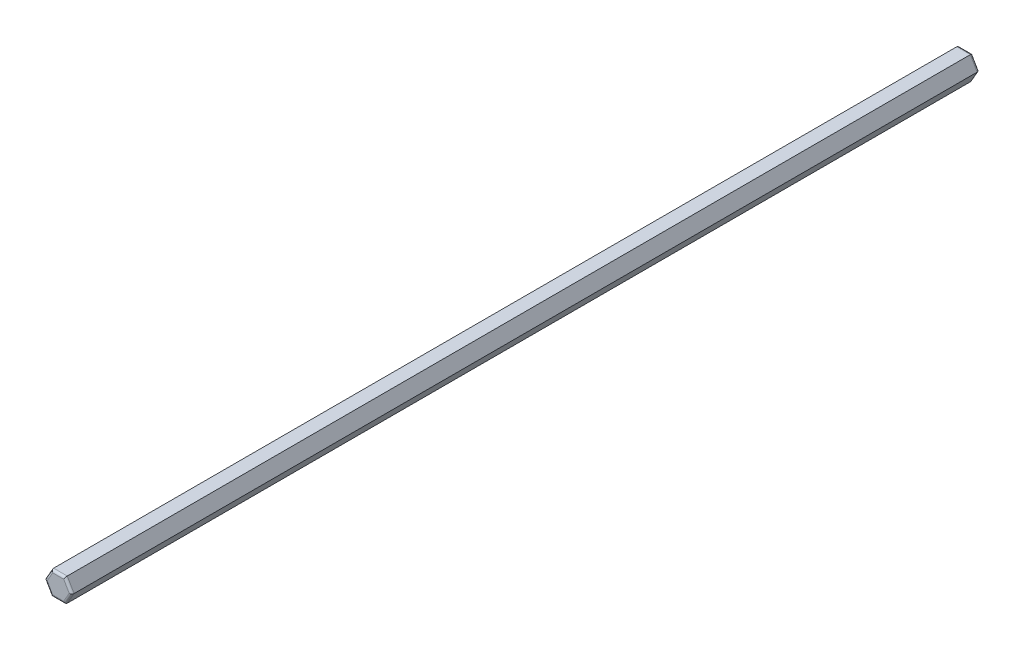
ISO-10303-21;
HEADER;
FILE_DESCRIPTION(('STEP AP214'),'2;1');
FILE_NAME('part.step','',(''),(''),'','','');
FILE_SCHEMA(('AUTOMOTIVE_DESIGN { 1 0 10303 214 1 1 1 1 }'));
ENDSEC;
DATA;
#1=APPLICATION_CONTEXT('core data for automotive mechanical design processes');
#2=APPLICATION_PROTOCOL_DEFINITION('international standard','automotive_design',2000,#1);
#3=PRODUCT_CONTEXT('',#1,'mechanical');
#4=PRODUCT('Part','Part','',(#3));
#5=PRODUCT_RELATED_PRODUCT_CATEGORY('part','',(#4));
#6=PRODUCT_DEFINITION_FORMATION('','',#4);
#7=PRODUCT_DEFINITION_CONTEXT('part definition',#1,'design');
#8=PRODUCT_DEFINITION('design','',#6,#7);
#9=PRODUCT_DEFINITION_SHAPE('','',#8);
#10=(LENGTH_UNIT() NAMED_UNIT(*) SI_UNIT(.MILLI.,.METRE.));
#11=(NAMED_UNIT(*) PLANE_ANGLE_UNIT() SI_UNIT($,.RADIAN.));
#12=(NAMED_UNIT(*) SI_UNIT($,.STERADIAN.) SOLID_ANGLE_UNIT());
#13=UNCERTAINTY_MEASURE_WITH_UNIT(LENGTH_MEASURE(1.E-05),#10,'distance_accuracy_value','');
#14=(GEOMETRIC_REPRESENTATION_CONTEXT(3) GLOBAL_UNCERTAINTY_ASSIGNED_CONTEXT((#13)) GLOBAL_UNIT_ASSIGNED_CONTEXT((#10,
#11,#12)) REPRESENTATION_CONTEXT('',''));
#15=CARTESIAN_POINT('',(0.,0.,0.));
#16=DIRECTION('',(0.,0.,1.));
#17=DIRECTION('',(1.,0.,0.));
#18=AXIS2_PLACEMENT_3D('',#15,#16,#17);
#19=CARTESIAN_POINT('',(0.749999999999999,1.29903810567666,-50.));
#20=DIRECTION('',(0.,1.,0.));
#21=DIRECTION('',(0.,0.,1.));
#22=AXIS2_PLACEMENT_3D('',#19,#20,#21);
#23=PLANE('',#22);
#24=DIRECTION('',(0.,0.,1.));
#25=VECTOR('',#24,1.);
#26=CARTESIAN_POINT('',(0.749999999999999,1.29903810567666,-50.));
#27=LINE('',#26,#25);
#28=CARTESIAN_POINT('',(0.749999999999999,1.29903810567666,-49.75));
#29=VERTEX_POINT('',#28);
#30=CARTESIAN_POINT('',(0.749999999999999,1.29903810567666,49.75));
#31=VERTEX_POINT('',#30);
#32=EDGE_CURVE('E161',#29,#31,#27,.T.);
#33=ORIENTED_EDGE('',*,*,#32,.F.);
#34=DIRECTION('',(-1.,0.,0.));
#35=VECTOR('',#34,1.);
#36=CARTESIAN_POINT('',(-0.75,1.29903810567666,-49.75));
#37=LINE('',#36,#35);
#38=CARTESIAN_POINT('',(-0.75,1.29903810567666,-49.75));
#39=VERTEX_POINT('',#38);
#40=EDGE_CURVE('E202',#29,#39,#37,.T.);
#41=ORIENTED_EDGE('',*,*,#40,.T.);
#42=DIRECTION('',(0.,0.,1.));
#43=VECTOR('',#42,1.);
#44=CARTESIAN_POINT('',(-0.75,1.29903810567666,-50.));
#45=LINE('',#44,#43);
#46=CARTESIAN_POINT('',(-0.75,1.29903810567666,49.75));
#47=VERTEX_POINT('',#46);
#48=EDGE_CURVE('E172',#39,#47,#45,.T.);
#49=ORIENTED_EDGE('',*,*,#48,.T.);
#50=DIRECTION('',(-1.,0.,0.));
#51=VECTOR('',#50,1.);
#52=CARTESIAN_POINT('',(0.749999999999999,1.29903810567666,49.75));
#53=LINE('',#52,#51);
#54=EDGE_CURVE('E200',#47,#31,#53,.F.);
#55=ORIENTED_EDGE('',*,*,#54,.T.);
#56=EDGE_LOOP('',(#33,#41,#49,#55));
#57=FACE_BOUND('',#56,.T.);
#58=ADVANCED_FACE('F32',(#57),#23,.T.);
#59=CARTESIAN_POINT('',(1.5,0.,-50.));
#60=DIRECTION('',(0.866025403784439,0.5,0.));
#61=DIRECTION('',(-0.5,0.866025403784439,0.));
#62=AXIS2_PLACEMENT_3D('',#59,#60,#61);
#63=PLANE('',#62);
#64=DIRECTION('',(0.,0.,1.));
#65=VECTOR('',#64,1.);
#66=CARTESIAN_POINT('',(1.5,0.,-50.));
#67=LINE('',#66,#65);
#68=CARTESIAN_POINT('',(1.5,0.,-49.75));
#69=VERTEX_POINT('',#68);
#70=CARTESIAN_POINT('',(1.5,0.,49.75));
#71=VERTEX_POINT('',#70);
#72=EDGE_CURVE('E151',#69,#71,#67,.T.);
#73=ORIENTED_EDGE('',*,*,#72,.F.);
#74=DIRECTION('',(-0.5,0.866025403784439,0.));
#75=VECTOR('',#74,1.);
#76=CARTESIAN_POINT('',(0.749999999999999,1.29903810567666,-49.75));
#77=LINE('',#76,#75);
#78=EDGE_CURVE('E136',#69,#29,#77,.T.);
#79=ORIENTED_EDGE('',*,*,#78,.T.);
#80=ORIENTED_EDGE('',*,*,#32,.T.);
#81=DIRECTION('',(-0.5,0.866025403784439,0.));
#82=VECTOR('',#81,1.);
#83=CARTESIAN_POINT('',(1.5,0.,49.75));
#84=LINE('',#83,#82);
#85=EDGE_CURVE('E145',#31,#71,#84,.F.);
#86=ORIENTED_EDGE('',*,*,#85,.T.);
#87=EDGE_LOOP('',(#73,#79,#80,#86));
#88=FACE_BOUND('',#87,.T.);
#89=ADVANCED_FACE('F159',(#88),#63,.T.);
#90=CARTESIAN_POINT('',(0.750000000000001,-1.29903810567666,-50.));
#91=DIRECTION('',(0.866025403784439,-0.499999999999999,0.));
#92=DIRECTION('',(0.499999999999999,0.866025403784439,0.));
#93=AXIS2_PLACEMENT_3D('',#90,#91,#92);
#94=PLANE('',#93);
#95=DIRECTION('',(0.,0.,1.));
#96=VECTOR('',#95,1.);
#97=CARTESIAN_POINT('',(0.750000000000001,-1.29903810567666,-50.));
#98=LINE('',#97,#96);
#99=CARTESIAN_POINT('',(0.750000000000001,-1.29903810567666,-49.75));
#100=VERTEX_POINT('',#99);
#101=CARTESIAN_POINT('',(0.750000000000001,-1.29903810567666,49.75));
#102=VERTEX_POINT('',#101);
#103=EDGE_CURVE('E154',#100,#102,#98,.T.);
#104=ORIENTED_EDGE('',*,*,#103,.F.);
#105=DIRECTION('',(0.499999999999999,0.866025403784439,0.));
#106=VECTOR('',#105,1.);
#107=CARTESIAN_POINT('',(1.5,0.,-49.75));
#108=LINE('',#107,#106);
#109=EDGE_CURVE('E128',#100,#69,#108,.T.);
#110=ORIENTED_EDGE('',*,*,#109,.T.);
#111=ORIENTED_EDGE('',*,*,#72,.T.);
#112=DIRECTION('',(0.499999999999999,0.866025403784439,0.));
#113=VECTOR('',#112,1.);
#114=CARTESIAN_POINT('',(0.750000000000001,-1.29903810567666,49.75));
#115=LINE('',#114,#113);
#116=EDGE_CURVE('E157',#71,#102,#115,.F.);
#117=ORIENTED_EDGE('',*,*,#116,.T.);
#118=EDGE_LOOP('',(#104,#110,#111,#117));
#119=FACE_BOUND('',#118,.T.);
#120=ADVANCED_FACE('F150',(#119),#94,.T.);
#121=CARTESIAN_POINT('',(-0.749999999999999,-1.29903810567666,-50.));
#122=DIRECTION('',(0.,-1.,0.));
#123=DIRECTION('',(0.,0.,-1.));
#124=AXIS2_PLACEMENT_3D('',#121,#122,#123);
#125=PLANE('',#124);
#126=DIRECTION('',(0.,0.,1.));
#127=VECTOR('',#126,1.);
#128=CARTESIAN_POINT('',(-0.749999999999999,-1.29903810567666,-50.));
#129=LINE('',#128,#127);
#130=CARTESIAN_POINT('',(-0.749999999999999,-1.29903810567666,-49.75));
#131=VERTEX_POINT('',#130);
#132=CARTESIAN_POINT('',(-0.749999999999999,-1.29903810567666,49.75));
#133=VERTEX_POINT('',#132);
#134=EDGE_CURVE('E164',#131,#133,#129,.T.);
#135=ORIENTED_EDGE('',*,*,#134,.F.);
#136=DIRECTION('',(1.,0.,0.));
#137=VECTOR('',#136,1.);
#138=CARTESIAN_POINT('',(0.750000000000001,-1.29903810567666,-49.75));
#139=LINE('',#138,#137);
#140=EDGE_CURVE('E189',#131,#100,#139,.T.);
#141=ORIENTED_EDGE('',*,*,#140,.T.);
#142=ORIENTED_EDGE('',*,*,#103,.T.);
#143=DIRECTION('',(1.,0.,0.));
#144=VECTOR('',#143,1.);
#145=CARTESIAN_POINT('',(-0.749999999999999,-1.29903810567666,49.75));
#146=LINE('',#145,#144);
#147=EDGE_CURVE('E187',#102,#133,#146,.F.);
#148=ORIENTED_EDGE('',*,*,#147,.T.);
#149=EDGE_LOOP('',(#135,#141,#142,#148));
#150=FACE_BOUND('',#149,.T.);
#151=ADVANCED_FACE('F246',(#150),#125,.T.);
#152=CARTESIAN_POINT('',(-1.5,0.,-50.));
#153=DIRECTION('',(-0.866025403784438,-0.500000000000001,0.));
#154=DIRECTION('',(0.500000000000001,-0.866025403784438,0.));
#155=AXIS2_PLACEMENT_3D('',#152,#153,#154);
#156=PLANE('',#155);
#157=DIRECTION('',(0.,0.,1.));
#158=VECTOR('',#157,1.);
#159=CARTESIAN_POINT('',(-1.5,0.,-50.));
#160=LINE('',#159,#158);
#161=CARTESIAN_POINT('',(-1.5,0.,-49.75));
#162=VERTEX_POINT('',#161);
#163=CARTESIAN_POINT('',(-1.5,0.,49.75));
#164=VERTEX_POINT('',#163);
#165=EDGE_CURVE('E169',#162,#164,#160,.T.);
#166=ORIENTED_EDGE('',*,*,#165,.F.);
#167=DIRECTION('',(0.500000000000001,-0.866025403784438,0.));
#168=VECTOR('',#167,1.);
#169=CARTESIAN_POINT('',(-0.749999999999999,-1.29903810567666,-49.75));
#170=LINE('',#169,#168);
#171=EDGE_CURVE('E193',#162,#131,#170,.T.);
#172=ORIENTED_EDGE('',*,*,#171,.T.);
#173=ORIENTED_EDGE('',*,*,#134,.T.);
#174=DIRECTION('',(0.500000000000001,-0.866025403784438,0.));
#175=VECTOR('',#174,1.);
#176=CARTESIAN_POINT('',(-1.5,0.,49.75));
#177=LINE('',#176,#175);
#178=EDGE_CURVE('E191',#133,#164,#177,.F.);
#179=ORIENTED_EDGE('',*,*,#178,.T.);
#180=EDGE_LOOP('',(#166,#172,#173,#179));
#181=FACE_BOUND('',#180,.T.);
#182=ADVANCED_FACE('F274',(#181),#156,.T.);
#183=CARTESIAN_POINT('',(-0.75,1.29903810567666,-50.));
#184=DIRECTION('',(-0.866025403784439,0.5,0.));
#185=DIRECTION('',(-0.5,-0.866025403784439,0.));
#186=AXIS2_PLACEMENT_3D('',#183,#184,#185);
#187=PLANE('',#186);
#188=ORIENTED_EDGE('',*,*,#48,.F.);
#189=DIRECTION('',(-0.5,-0.866025403784439,0.));
#190=VECTOR('',#189,1.);
#191=CARTESIAN_POINT('',(-1.5,0.,-49.75));
#192=LINE('',#191,#190);
#193=EDGE_CURVE('E198',#39,#162,#192,.T.);
#194=ORIENTED_EDGE('',*,*,#193,.T.);
#195=ORIENTED_EDGE('',*,*,#165,.T.);
#196=DIRECTION('',(-0.5,-0.866025403784439,0.));
#197=VECTOR('',#196,1.);
#198=CARTESIAN_POINT('',(-0.75,1.29903810567666,49.75));
#199=LINE('',#198,#197);
#200=EDGE_CURVE('E195',#164,#47,#199,.F.);
#201=ORIENTED_EDGE('',*,*,#200,.T.);
#202=EDGE_LOOP('',(#188,#194,#195,#201));
#203=FACE_BOUND('',#202,.T.);
#204=ADVANCED_FACE('F265',(#203),#187,.T.);
#205=CARTESIAN_POINT('',(0.,0.,-50.));
#206=DIRECTION('',(0.,0.,1.));
#207=DIRECTION('',(1.,0.,0.));
#208=AXIS2_PLACEMENT_3D('',#205,#206,#207);
#209=PLANE('',#208);
#210=DIRECTION('',(-0.5,0.866025403784439,0.));
#211=VECTOR('',#210,1.);
#212=CARTESIAN_POINT('',(1.28349364905389,-0.125,-50.));
#213=LINE('',#212,#211);
#214=CARTESIAN_POINT('',(0.605662432702593,1.04903810567666,-50.));
#215=VERTEX_POINT('',#214);
#216=CARTESIAN_POINT('',(1.21132486540519,0.,-50.));
#217=VERTEX_POINT('',#216);
#218=EDGE_CURVE('E156',#215,#217,#213,.F.);
#219=ORIENTED_EDGE('',*,*,#218,.T.);
#220=DIRECTION('',(0.499999999999999,0.866025403784439,0.));
#221=VECTOR('',#220,1.);
#222=CARTESIAN_POINT('',(0.533493649053891,-1.17403810567666,-50.));
#223=LINE('',#222,#221);
#224=CARTESIAN_POINT('',(0.605662432702594,-1.04903810567666,-50.));
#225=VERTEX_POINT('',#224);
#226=EDGE_CURVE('E130',#217,#225,#223,.F.);
#227=ORIENTED_EDGE('',*,*,#226,.T.);
#228=DIRECTION('',(1.,0.,0.));
#229=VECTOR('',#228,1.);
#230=CARTESIAN_POINT('',(-0.749999999999999,-1.04903810567666,-50.));
#231=LINE('',#230,#229);
#232=CARTESIAN_POINT('',(-0.605662432702592,-1.04903810567666,-50.));
#233=VERTEX_POINT('',#232);
#234=EDGE_CURVE('E184',#225,#233,#231,.F.);
#235=ORIENTED_EDGE('',*,*,#234,.T.);
#236=DIRECTION('',(0.500000000000001,-0.866025403784438,0.));
#237=VECTOR('',#236,1.);
#238=CARTESIAN_POINT('',(-1.28349364905389,0.125,-50.));
#239=LINE('',#238,#237);
#240=CARTESIAN_POINT('',(-1.21132486540519,0.,-50.));
#241=VERTEX_POINT('',#240);
#242=EDGE_CURVE('E182',#233,#241,#239,.F.);
#243=ORIENTED_EDGE('',*,*,#242,.T.);
#244=DIRECTION('',(-0.5,-0.866025403784439,0.));
#245=VECTOR('',#244,1.);
#246=CARTESIAN_POINT('',(-0.533493649053891,1.17403810567666,-50.));
#247=LINE('',#246,#245);
#248=CARTESIAN_POINT('',(-0.605662432702594,1.04903810567666,-50.));
#249=VERTEX_POINT('',#248);
#250=EDGE_CURVE('E180',#241,#249,#247,.F.);
#251=ORIENTED_EDGE('',*,*,#250,.T.);
#252=DIRECTION('',(-1.,0.,0.));
#253=VECTOR('',#252,1.);
#254=CARTESIAN_POINT('',(0.749999999999999,1.04903810567666,-50.));
#255=LINE('',#254,#253);
#256=EDGE_CURVE('E178',#249,#215,#255,.F.);
#257=ORIENTED_EDGE('',*,*,#256,.T.);
#258=EDGE_LOOP('',(#219,#227,#235,#243,#251,#257));
#259=FACE_BOUND('',#258,.T.);
#260=ADVANCED_FACE('F254',(#259),#209,.F.);
#261=CARTESIAN_POINT('',(0.,0.,50.));
#262=DIRECTION('',(0.,0.,1.));
#263=DIRECTION('',(1.,0.,0.));
#264=AXIS2_PLACEMENT_3D('',#261,#262,#263);
#265=PLANE('',#264);
#266=DIRECTION('',(-1.,0.,0.));
#267=VECTOR('',#266,1.);
#268=CARTESIAN_POINT('',(0.,1.04903810567666,50.));
#269=LINE('',#268,#267);
#270=CARTESIAN_POINT('',(0.605662432702593,1.04903810567666,50.));
#271=VERTEX_POINT('',#270);
#272=CARTESIAN_POINT('',(-0.605662432702594,1.04903810567666,50.));
#273=VERTEX_POINT('',#272);
#274=EDGE_CURVE('E144',#271,#273,#269,.T.);
#275=ORIENTED_EDGE('',*,*,#274,.T.);
#276=DIRECTION('',(-0.5,-0.866025403784439,0.));
#277=VECTOR('',#276,1.);
#278=CARTESIAN_POINT('',(-0.908493649053891,0.524519052838329,50.));
#279=LINE('',#278,#277);
#280=CARTESIAN_POINT('',(-1.21132486540519,0.,50.));
#281=VERTEX_POINT('',#280);
#282=EDGE_CURVE('E11',#273,#281,#279,.T.);
#283=ORIENTED_EDGE('',*,*,#282,.T.);
#284=DIRECTION('',(0.500000000000001,-0.866025403784438,0.));
#285=VECTOR('',#284,1.);
#286=CARTESIAN_POINT('',(-0.90849364905389,-0.524519052838329,50.));
#287=LINE('',#286,#285);
#288=CARTESIAN_POINT('',(-0.605662432702593,-1.04903810567666,50.));
#289=VERTEX_POINT('',#288);
#290=EDGE_CURVE('E41',#281,#289,#287,.T.);
#291=ORIENTED_EDGE('',*,*,#290,.T.);
#292=DIRECTION('',(1.,0.,0.));
#293=VECTOR('',#292,1.);
#294=CARTESIAN_POINT('',(0.,-1.04903810567666,50.));
#295=LINE('',#294,#293);
#296=CARTESIAN_POINT('',(0.605662432702594,-1.04903810567666,50.));
#297=VERTEX_POINT('',#296);
#298=EDGE_CURVE('E210',#289,#297,#295,.T.);
#299=ORIENTED_EDGE('',*,*,#298,.T.);
#300=DIRECTION('',(0.499999999999999,0.866025403784439,0.));
#301=VECTOR('',#300,1.);
#302=CARTESIAN_POINT('',(0.908493649053891,-0.524519052838328,50.));
#303=LINE('',#302,#301);
#304=CARTESIAN_POINT('',(1.21132486540519,0.,50.));
#305=VERTEX_POINT('',#304);
#306=EDGE_CURVE('E208',#297,#305,#303,.T.);
#307=ORIENTED_EDGE('',*,*,#306,.T.);
#308=DIRECTION('',(-0.5,0.866025403784439,0.));
#309=VECTOR('',#308,1.);
#310=CARTESIAN_POINT('',(0.90849364905389,0.524519052838329,50.));
#311=LINE('',#310,#309);
#312=EDGE_CURVE('E206',#305,#271,#311,.T.);
#313=ORIENTED_EDGE('',*,*,#312,.T.);
#314=EDGE_LOOP('',(#275,#283,#291,#299,#307,#313));
#315=FACE_BOUND('',#314,.T.);
#316=ADVANCED_FACE('F282',(#315),#265,.T.);
#317=CARTESIAN_POINT('',(-0.533493649053891,1.17403810567666,-49.75));
#318=DIRECTION('',(0.5,0.866025403784439,0.));
#319=DIRECTION('',(-0.866025403784439,0.5,0.));
#320=AXIS2_PLACEMENT_3D('',#317,#318,#319);
#321=CYLINDRICAL_SURFACE('',#320,0.25);
#322=CARTESIAN_POINT('',(-0.605662432702594,1.04903810567666,-49.75));
#323=DIRECTION('',(0.866025403784438,0.5,0.));
#324=DIRECTION('',(0.5,-0.866025403784439,0.));
#325=AXIS2_PLACEMENT_3D('',#322,#323,#324);
#326=ELLIPSE('',#325,0.288675134594813,0.25);
#327=EDGE_CURVE('E218',#249,#39,#326,.T.);
#328=ORIENTED_EDGE('',*,*,#327,.F.);
#329=ORIENTED_EDGE('',*,*,#250,.F.);
#330=CARTESIAN_POINT('',(-1.21132486540519,0.,-49.75));
#331=DIRECTION('',(0.,1.,0.));
#332=DIRECTION('',(1.,0.,0.));
#333=AXIS2_PLACEMENT_3D('',#330,#331,#332);
#334=ELLIPSE('',#333,0.288675134594813,0.25);
#335=EDGE_CURVE('E175',#162,#241,#334,.F.);
#336=ORIENTED_EDGE('',*,*,#335,.F.);
#337=ORIENTED_EDGE('',*,*,#193,.F.);
#338=EDGE_LOOP('',(#328,#329,#336,#337));
#339=FACE_BOUND('',#338,.T.);
#340=ADVANCED_FACE('F269',(#339),#321,.T.);
#341=CARTESIAN_POINT('',(-1.28349364905389,0.125,-49.75));
#342=DIRECTION('',(-0.500000000000001,0.866025403784438,0.));
#343=DIRECTION('',(-0.866025403784438,-0.500000000000001,0.));
#344=AXIS2_PLACEMENT_3D('',#341,#342,#343);
#345=CYLINDRICAL_SURFACE('',#344,0.25);
#346=ORIENTED_EDGE('',*,*,#335,.T.);
#347=ORIENTED_EDGE('',*,*,#242,.F.);
#348=CARTESIAN_POINT('',(-0.605662432702593,-1.04903810567666,-49.75));
#349=DIRECTION('',(-0.866025403784439,0.5,0.));
#350=DIRECTION('',(0.5,0.866025403784439,0.));
#351=AXIS2_PLACEMENT_3D('',#348,#349,#350);
#352=ELLIPSE('',#351,0.288675134594813,0.25);
#353=EDGE_CURVE('E215',#131,#233,#352,.F.);
#354=ORIENTED_EDGE('',*,*,#353,.F.);
#355=ORIENTED_EDGE('',*,*,#171,.F.);
#356=EDGE_LOOP('',(#346,#347,#354,#355));
#357=FACE_BOUND('',#356,.T.);
#358=ADVANCED_FACE('F272',(#357),#345,.T.);
#359=CARTESIAN_POINT('',(0.749999999999999,1.04903810567666,-49.75));
#360=DIRECTION('',(1.,0.,0.));
#361=DIRECTION('',(0.,0.,-1.));
#362=AXIS2_PLACEMENT_3D('',#359,#360,#361);
#363=CYLINDRICAL_SURFACE('',#362,0.25);
#364=ORIENTED_EDGE('',*,*,#327,.T.);
#365=ORIENTED_EDGE('',*,*,#40,.F.);
#366=CARTESIAN_POINT('',(0.605662432702593,1.04903810567666,-49.75));
#367=DIRECTION('',(0.866025403784439,-0.5,0.));
#368=DIRECTION('',(-0.5,-0.866025403784439,0.));
#369=AXIS2_PLACEMENT_3D('',#366,#367,#368);
#370=ELLIPSE('',#369,0.288675134594813,0.25);
#371=EDGE_CURVE('E139',#215,#29,#370,.T.);
#372=ORIENTED_EDGE('',*,*,#371,.F.);
#373=ORIENTED_EDGE('',*,*,#256,.F.);
#374=EDGE_LOOP('',(#364,#365,#372,#373));
#375=FACE_BOUND('',#374,.T.);
#376=ADVANCED_FACE('F260',(#375),#363,.T.);
#377=CARTESIAN_POINT('',(-0.749999999999999,-1.04903810567666,-49.75));
#378=DIRECTION('',(-1.,0.,0.));
#379=DIRECTION('',(0.,0.,1.));
#380=AXIS2_PLACEMENT_3D('',#377,#378,#379);
#381=CYLINDRICAL_SURFACE('',#380,0.25);
#382=ORIENTED_EDGE('',*,*,#353,.T.);
#383=ORIENTED_EDGE('',*,*,#234,.F.);
#384=CARTESIAN_POINT('',(0.605662432702594,-1.04903810567666,-49.75));
#385=DIRECTION('',(-0.866025403784438,-0.500000000000001,0.));
#386=DIRECTION('',(-0.5,0.866025403784438,0.));
#387=AXIS2_PLACEMENT_3D('',#384,#385,#386);
#388=ELLIPSE('',#387,0.288675134594813,0.25);
#389=EDGE_CURVE('E133',#100,#225,#388,.F.);
#390=ORIENTED_EDGE('',*,*,#389,.F.);
#391=ORIENTED_EDGE('',*,*,#140,.F.);
#392=EDGE_LOOP('',(#382,#383,#390,#391));
#393=FACE_BOUND('',#392,.T.);
#394=ADVANCED_FACE('F250',(#393),#381,.T.);
#395=CARTESIAN_POINT('',(1.28349364905389,-0.125,-49.75));
#396=DIRECTION('',(0.5,-0.866025403784439,0.));
#397=DIRECTION('',(0.866025403784439,0.5,0.));
#398=AXIS2_PLACEMENT_3D('',#395,#396,#397);
#399=CYLINDRICAL_SURFACE('',#398,0.25);
#400=ORIENTED_EDGE('',*,*,#371,.T.);
#401=ORIENTED_EDGE('',*,*,#78,.F.);
#402=CARTESIAN_POINT('',(1.21132486540519,0.,-49.75));
#403=DIRECTION('',(0.,-1.,0.));
#404=DIRECTION('',(1.,0.,0.));
#405=AXIS2_PLACEMENT_3D('',#402,#403,#404);
#406=ELLIPSE('',#405,0.288675134594813,0.25);
#407=EDGE_CURVE('E124',#217,#69,#406,.T.);
#408=ORIENTED_EDGE('',*,*,#407,.F.);
#409=ORIENTED_EDGE('',*,*,#218,.F.);
#410=EDGE_LOOP('',(#400,#401,#408,#409));
#411=FACE_BOUND('',#410,.T.);
#412=ADVANCED_FACE('F137',(#411),#399,.T.);
#413=CARTESIAN_POINT('',(0.533493649053891,-1.17403810567666,-49.75));
#414=DIRECTION('',(-0.499999999999999,-0.866025403784439,0.));
#415=DIRECTION('',(0.866025403784439,-0.499999999999999,0.));
#416=AXIS2_PLACEMENT_3D('',#413,#414,#415);
#417=CYLINDRICAL_SURFACE('',#416,0.25);
#418=ORIENTED_EDGE('',*,*,#389,.T.);
#419=ORIENTED_EDGE('',*,*,#226,.F.);
#420=ORIENTED_EDGE('',*,*,#407,.T.);
#421=ORIENTED_EDGE('',*,*,#109,.F.);
#422=EDGE_LOOP('',(#418,#419,#420,#421));
#423=FACE_BOUND('',#422,.T.);
#424=ADVANCED_FACE('F126',(#423),#417,.T.);
#425=CARTESIAN_POINT('',(0.908493649053891,-0.524519052838328,49.75));
#426=DIRECTION('',(0.499999999999999,0.866025403784439,0.));
#427=DIRECTION('',(-0.866025403784439,0.499999999999999,0.));
#428=AXIS2_PLACEMENT_3D('',#425,#426,#427);
#429=CYLINDRICAL_SURFACE('',#428,0.25);
#430=CARTESIAN_POINT('',(0.605662432702595,-1.04903810567666,49.75));
#431=DIRECTION('',(0.866025403784438,0.500000000000001,0.));
#432=DIRECTION('',(-0.5,0.866025403784438,0.));
#433=AXIS2_PLACEMENT_3D('',#430,#431,#432);
#434=ELLIPSE('',#433,0.288675134594813,0.25);
#435=EDGE_CURVE('E231',#102,#297,#434,.F.);
#436=ORIENTED_EDGE('',*,*,#435,.F.);
#437=ORIENTED_EDGE('',*,*,#116,.F.);
#438=CARTESIAN_POINT('',(1.21132486540519,0.,49.75));
#439=DIRECTION('',(0.,1.,0.));
#440=DIRECTION('',(-1.,0.,0.));
#441=AXIS2_PLACEMENT_3D('',#438,#439,#440);
#442=ELLIPSE('',#441,0.288675134594813,0.25);
#443=EDGE_CURVE('E36',#305,#71,#442,.T.);
#444=ORIENTED_EDGE('',*,*,#443,.F.);
#445=ORIENTED_EDGE('',*,*,#306,.F.);
#446=EDGE_LOOP('',(#436,#437,#444,#445));
#447=FACE_BOUND('',#446,.T.);
#448=ADVANCED_FACE('F34',(#447),#429,.T.);
#449=CARTESIAN_POINT('',(0.90849364905389,0.524519052838329,49.75));
#450=DIRECTION('',(-0.5,0.866025403784439,0.));
#451=DIRECTION('',(-0.866025403784439,-0.5,0.));
#452=AXIS2_PLACEMENT_3D('',#449,#450,#451);
#453=CYLINDRICAL_SURFACE('',#452,0.25);
#454=ORIENTED_EDGE('',*,*,#443,.T.);
#455=ORIENTED_EDGE('',*,*,#85,.F.);
#456=CARTESIAN_POINT('',(0.605662432702592,1.04903810567666,49.75));
#457=DIRECTION('',(-0.866025403784439,0.5,0.));
#458=DIRECTION('',(-0.5,-0.866025403784439,0.));
#459=AXIS2_PLACEMENT_3D('',#456,#457,#458);
#460=ELLIPSE('',#459,0.288675134594813,0.25);
#461=EDGE_CURVE('E229',#271,#31,#460,.T.);
#462=ORIENTED_EDGE('',*,*,#461,.F.);
#463=ORIENTED_EDGE('',*,*,#312,.F.);
#464=EDGE_LOOP('',(#454,#455,#462,#463));
#465=FACE_BOUND('',#464,.T.);
#466=ADVANCED_FACE('F240',(#465),#453,.T.);
#467=CARTESIAN_POINT('',(0.,-1.04903810567666,49.75));
#468=DIRECTION('',(1.,0.,0.));
#469=DIRECTION('',(0.,0.,-1.));
#470=AXIS2_PLACEMENT_3D('',#467,#468,#469);
#471=CYLINDRICAL_SURFACE('',#470,0.25);
#472=ORIENTED_EDGE('',*,*,#435,.T.);
#473=ORIENTED_EDGE('',*,*,#298,.F.);
#474=CARTESIAN_POINT('',(-0.605662432702593,-1.04903810567666,49.75));
#475=DIRECTION('',(0.866025403784439,-0.5,0.));
#476=DIRECTION('',(0.5,0.866025403784439,0.));
#477=AXIS2_PLACEMENT_3D('',#474,#475,#476);
#478=ELLIPSE('',#477,0.288675134594813,0.25);
#479=EDGE_CURVE('E226',#133,#289,#478,.F.);
#480=ORIENTED_EDGE('',*,*,#479,.F.);
#481=ORIENTED_EDGE('',*,*,#147,.F.);
#482=EDGE_LOOP('',(#472,#473,#480,#481));
#483=FACE_BOUND('',#482,.T.);
#484=ADVANCED_FACE('F287',(#483),#471,.T.);
#485=CARTESIAN_POINT('',(0.,1.04903810567666,49.75));
#486=DIRECTION('',(-1.,0.,0.));
#487=DIRECTION('',(0.,0.,1.));
#488=AXIS2_PLACEMENT_3D('',#485,#486,#487);
#489=CYLINDRICAL_SURFACE('',#488,0.25);
#490=ORIENTED_EDGE('',*,*,#461,.T.);
#491=ORIENTED_EDGE('',*,*,#54,.F.);
#492=CARTESIAN_POINT('',(-0.605662432702594,1.04903810567666,49.75));
#493=DIRECTION('',(-0.866025403784438,-0.5,0.));
#494=DIRECTION('',(-0.5,0.866025403784439,0.));
#495=AXIS2_PLACEMENT_3D('',#492,#493,#494);
#496=ELLIPSE('',#495,0.288675134594813,0.25);
#497=EDGE_CURVE('E224',#273,#47,#496,.T.);
#498=ORIENTED_EDGE('',*,*,#497,.F.);
#499=ORIENTED_EDGE('',*,*,#274,.F.);
#500=EDGE_LOOP('',(#490,#491,#498,#499));
#501=FACE_BOUND('',#500,.T.);
#502=ADVANCED_FACE('F285',(#501),#489,.T.);
#503=CARTESIAN_POINT('',(-0.90849364905389,-0.524519052838329,49.75));
#504=DIRECTION('',(0.500000000000001,-0.866025403784438,0.));
#505=DIRECTION('',(0.866025403784438,0.500000000000001,0.));
#506=AXIS2_PLACEMENT_3D('',#503,#504,#505);
#507=CYLINDRICAL_SURFACE('',#506,0.25);
#508=ORIENTED_EDGE('',*,*,#479,.T.);
#509=ORIENTED_EDGE('',*,*,#290,.F.);
#510=CARTESIAN_POINT('',(-1.21132486540519,0.,49.75));
#511=DIRECTION('',(0.,-1.,0.));
#512=DIRECTION('',(1.,0.,0.));
#513=AXIS2_PLACEMENT_3D('',#510,#511,#512);
#514=ELLIPSE('',#513,0.288675134594813,0.25);
#515=EDGE_CURVE('E49',#164,#281,#514,.F.);
#516=ORIENTED_EDGE('',*,*,#515,.F.);
#517=ORIENTED_EDGE('',*,*,#178,.F.);
#518=EDGE_LOOP('',(#508,#509,#516,#517));
#519=FACE_BOUND('',#518,.T.);
#520=ADVANCED_FACE('F281',(#519),#507,.T.);
#521=CARTESIAN_POINT('',(-0.908493649053891,0.524519052838329,49.75));
#522=DIRECTION('',(-0.5,-0.866025403784439,0.));
#523=DIRECTION('',(0.866025403784439,-0.5,0.));
#524=AXIS2_PLACEMENT_3D('',#521,#522,#523);
#525=CYLINDRICAL_SURFACE('',#524,0.25);
#526=ORIENTED_EDGE('',*,*,#497,.T.);
#527=ORIENTED_EDGE('',*,*,#200,.F.);
#528=ORIENTED_EDGE('',*,*,#515,.T.);
#529=ORIENTED_EDGE('',*,*,#282,.F.);
#530=EDGE_LOOP('',(#526,#527,#528,#529));
#531=FACE_BOUND('',#530,.T.);
#532=ADVANCED_FACE('F277',(#531),#525,.T.);
#533=CLOSED_SHELL('',(#58,#89,#120,#151,#182,#204,#260,#316,#340,#358,#376,#394,#412,#424,#448,
#466,#484,#502,#520,#532));
#534=MANIFOLD_SOLID_BREP('B2',#533);
#535=ADVANCED_BREP_SHAPE_REPRESENTATION('',(#18,#534),#14);
#536=SHAPE_DEFINITION_REPRESENTATION(#9,#535);
ENDSEC;
END-ISO-10303-21;
